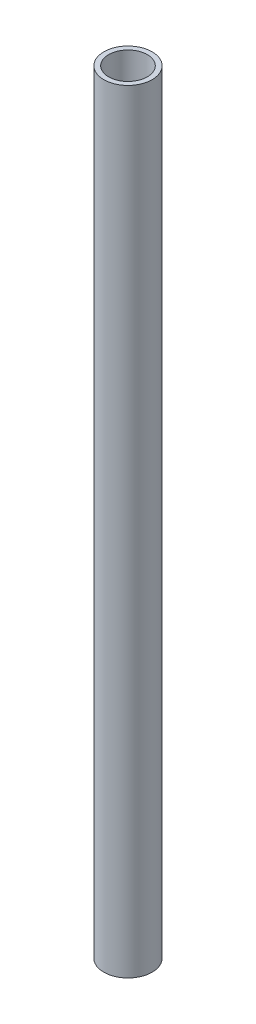
ISO-10303-21;
HEADER;
FILE_DESCRIPTION(('STEP AP214'),'2;1');
FILE_NAME('part.step','',(''),(''),'','','');
FILE_SCHEMA(('AUTOMOTIVE_DESIGN { 1 0 10303 214 1 1 1 1 }'));
ENDSEC;
DATA;
#1=APPLICATION_CONTEXT('core data for automotive mechanical design processes');
#2=APPLICATION_PROTOCOL_DEFINITION('international standard','automotive_design',2000,#1);
#3=PRODUCT_CONTEXT('',#1,'mechanical');
#4=PRODUCT('Part','Part','',(#3));
#5=PRODUCT_RELATED_PRODUCT_CATEGORY('part','',(#4));
#6=PRODUCT_DEFINITION_FORMATION('','',#4);
#7=PRODUCT_DEFINITION_CONTEXT('part definition',#1,'design');
#8=PRODUCT_DEFINITION('design','',#6,#7);
#9=PRODUCT_DEFINITION_SHAPE('','',#8);
#10=(LENGTH_UNIT() NAMED_UNIT(*) SI_UNIT(.MILLI.,.METRE.));
#11=(NAMED_UNIT(*) PLANE_ANGLE_UNIT() SI_UNIT($,.RADIAN.));
#12=(NAMED_UNIT(*) SI_UNIT($,.STERADIAN.) SOLID_ANGLE_UNIT());
#13=UNCERTAINTY_MEASURE_WITH_UNIT(LENGTH_MEASURE(1.E-05),#10,'distance_accuracy_value','');
#14=(GEOMETRIC_REPRESENTATION_CONTEXT(3) GLOBAL_UNCERTAINTY_ASSIGNED_CONTEXT((#13)) GLOBAL_UNIT_ASSIGNED_CONTEXT((#10,
#11,#12)) REPRESENTATION_CONTEXT('',''));
#15=CARTESIAN_POINT('',(0.,0.,0.));
#16=DIRECTION('',(0.,0.,1.));
#17=DIRECTION('',(1.,0.,0.));
#18=AXIS2_PLACEMENT_3D('',#15,#16,#17);
#19=CARTESIAN_POINT('',(0.,101.6,0.));
#20=DIRECTION('',(0.,1.,0.));
#21=DIRECTION('',(0.,0.,1.));
#22=AXIS2_PLACEMENT_3D('',#19,#20,#21);
#23=PLANE('',#22);
#24=CARTESIAN_POINT('',(0.,101.6,0.));
#25=DIRECTION('',(0.,1.,0.));
#26=DIRECTION('',(0.,0.,1.));
#27=AXIS2_PLACEMENT_3D('',#24,#25,#26);
#28=CIRCLE('',#27,3.175);
#29=CARTESIAN_POINT('',(0.,101.6,3.175));
#30=VERTEX_POINT('',#29);
#31=EDGE_CURVE('E10',#30,#30,#28,.T.);
#32=ORIENTED_EDGE('',*,*,#31,.T.);
#33=EDGE_LOOP('',(#32));
#34=FACE_BOUND('',#33,.T.);
#35=CARTESIAN_POINT('',(0.,101.6,0.));
#36=DIRECTION('',(0.,1.,0.));
#37=DIRECTION('',(0.,0.,1.));
#38=AXIS2_PLACEMENT_3D('',#35,#36,#37);
#39=CIRCLE('',#38,2.54);
#40=CARTESIAN_POINT('',(0.,101.6,2.54));
#41=VERTEX_POINT('',#40);
#42=EDGE_CURVE('E48',#41,#41,#39,.T.);
#43=ORIENTED_EDGE('',*,*,#42,.F.);
#44=EDGE_LOOP('',(#43));
#45=FACE_BOUND('',#44,.T.);
#46=ADVANCED_FACE('F37',(#34,#45),#23,.T.);
#47=CARTESIAN_POINT('',(0.,0.,0.));
#48=DIRECTION('',(0.,1.,0.));
#49=DIRECTION('',(0.,0.,1.));
#50=AXIS2_PLACEMENT_3D('',#47,#48,#49);
#51=PLANE('',#50);
#52=CARTESIAN_POINT('',(0.,0.,0.));
#53=DIRECTION('',(0.,1.,0.));
#54=DIRECTION('',(0.,0.,1.));
#55=AXIS2_PLACEMENT_3D('',#52,#53,#54);
#56=CIRCLE('',#55,3.175);
#57=CARTESIAN_POINT('',(0.,0.,3.175));
#58=VERTEX_POINT('',#57);
#59=EDGE_CURVE('E41',#58,#58,#56,.T.);
#60=ORIENTED_EDGE('',*,*,#59,.F.);
#61=EDGE_LOOP('',(#60));
#62=FACE_BOUND('',#61,.T.);
#63=CARTESIAN_POINT('',(0.,0.,0.));
#64=DIRECTION('',(0.,1.,0.));
#65=DIRECTION('',(0.,0.,1.));
#66=AXIS2_PLACEMENT_3D('',#63,#64,#65);
#67=CIRCLE('',#66,2.54);
#68=CARTESIAN_POINT('',(0.,0.,2.54));
#69=VERTEX_POINT('',#68);
#70=EDGE_CURVE('E50',#69,#69,#67,.T.);
#71=ORIENTED_EDGE('',*,*,#70,.T.);
#72=EDGE_LOOP('',(#71));
#73=FACE_BOUND('',#72,.T.);
#74=ADVANCED_FACE('F60',(#62,#73),#51,.F.);
#75=CARTESIAN_POINT('',(0.,101.6,0.));
#76=DIRECTION('',(0.,-1.,0.));
#77=DIRECTION('',(0.,0.,-1.));
#78=AXIS2_PLACEMENT_3D('',#75,#76,#77);
#79=CYLINDRICAL_SURFACE('',#78,3.175);
#80=ORIENTED_EDGE('',*,*,#31,.F.);
#81=EDGE_LOOP('',(#80));
#82=FACE_BOUND('',#81,.T.);
#83=ORIENTED_EDGE('',*,*,#59,.T.);
#84=EDGE_LOOP('',(#83));
#85=FACE_BOUND('',#84,.T.);
#86=ADVANCED_FACE('F39',(#82,#85),#79,.T.);
#87=CARTESIAN_POINT('',(0.,101.6,0.));
#88=DIRECTION('',(0.,-1.,0.));
#89=DIRECTION('',(0.,0.,-1.));
#90=AXIS2_PLACEMENT_3D('',#87,#88,#89);
#91=CYLINDRICAL_SURFACE('',#90,2.54);
#92=ORIENTED_EDGE('',*,*,#42,.T.);
#93=EDGE_LOOP('',(#92));
#94=FACE_BOUND('',#93,.T.);
#95=ORIENTED_EDGE('',*,*,#70,.F.);
#96=EDGE_LOOP('',(#95));
#97=FACE_BOUND('',#96,.T.);
#98=ADVANCED_FACE('F56',(#94,#97),#91,.F.);
#99=CLOSED_SHELL('',(#46,#74,#86,#98));
#100=MANIFOLD_SOLID_BREP('B2',#99);
#101=ADVANCED_BREP_SHAPE_REPRESENTATION('',(#18,#100),#14);
#102=SHAPE_DEFINITION_REPRESENTATION(#9,#101);
ENDSEC;
END-ISO-10303-21;
